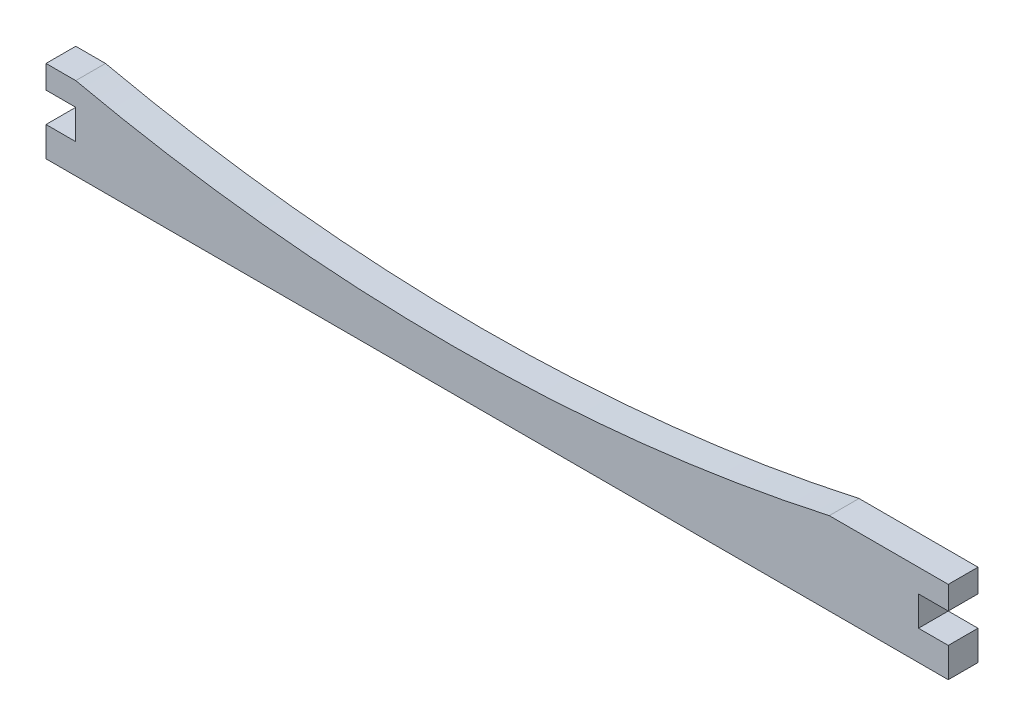
ISO-10303-21;
HEADER;
FILE_DESCRIPTION(('STEP AP214'),'2;1');
FILE_NAME('part.step','',(''),(''),'','','');
FILE_SCHEMA(('AUTOMOTIVE_DESIGN { 1 0 10303 214 1 1 1 1 }'));
ENDSEC;
DATA;
#1=APPLICATION_CONTEXT('core data for automotive mechanical design processes');
#2=APPLICATION_PROTOCOL_DEFINITION('international standard','automotive_design',2000,#1);
#3=PRODUCT_CONTEXT('',#1,'mechanical');
#4=PRODUCT('Part','Part','',(#3));
#5=PRODUCT_RELATED_PRODUCT_CATEGORY('part','',(#4));
#6=PRODUCT_DEFINITION_FORMATION('','',#4);
#7=PRODUCT_DEFINITION_CONTEXT('part definition',#1,'design');
#8=PRODUCT_DEFINITION('design','',#6,#7);
#9=PRODUCT_DEFINITION_SHAPE('','',#8);
#10=(LENGTH_UNIT() NAMED_UNIT(*) SI_UNIT(.MILLI.,.METRE.));
#11=(NAMED_UNIT(*) PLANE_ANGLE_UNIT() SI_UNIT($,.RADIAN.));
#12=(NAMED_UNIT(*) SI_UNIT($,.STERADIAN.) SOLID_ANGLE_UNIT());
#13=UNCERTAINTY_MEASURE_WITH_UNIT(LENGTH_MEASURE(1.E-05),#10,'distance_accuracy_value','');
#14=(GEOMETRIC_REPRESENTATION_CONTEXT(3) GLOBAL_UNCERTAINTY_ASSIGNED_CONTEXT((#13)) GLOBAL_UNIT_ASSIGNED_CONTEXT((#10,
#11,#12)) REPRESENTATION_CONTEXT('',''));
#15=CARTESIAN_POINT('',(0.,0.,0.));
#16=DIRECTION('',(0.,0.,1.));
#17=DIRECTION('',(1.,0.,0.));
#18=AXIS2_PLACEMENT_3D('',#15,#16,#17);
#19=CARTESIAN_POINT('',(-123.,0.,9.));
#20=DIRECTION('',(-1.,0.,0.));
#21=DIRECTION('',(0.,0.,1.));
#22=AXIS2_PLACEMENT_3D('',#19,#20,#21);
#23=PLANE('',#22);
#24=DIRECTION('',(0.,1.,0.));
#25=VECTOR('',#24,1.);
#26=CARTESIAN_POINT('',(-123.,0.,0.));
#27=LINE('',#26,#25);
#28=CARTESIAN_POINT('',(-123.,18.,0.));
#29=VERTEX_POINT('',#28);
#30=CARTESIAN_POINT('',(-123.,25.,0.));
#31=VERTEX_POINT('',#30);
#32=EDGE_CURVE('E228',#29,#31,#27,.T.);
#33=ORIENTED_EDGE('',*,*,#32,.F.);
#34=DIRECTION('',(0.,0.,-1.));
#35=VECTOR('',#34,1.);
#36=CARTESIAN_POINT('',(-123.,18.,9.));
#37=LINE('',#36,#35);
#38=CARTESIAN_POINT('',(-123.,18.,9.));
#39=VERTEX_POINT('',#38);
#40=EDGE_CURVE('E207',#39,#29,#37,.T.);
#41=ORIENTED_EDGE('',*,*,#40,.F.);
#42=DIRECTION('',(0.,1.,0.));
#43=VECTOR('',#42,1.);
#44=CARTESIAN_POINT('',(-123.,0.,9.));
#45=LINE('',#44,#43);
#46=CARTESIAN_POINT('',(-123.,25.,9.));
#47=VERTEX_POINT('',#46);
#48=EDGE_CURVE('E216',#39,#47,#45,.T.);
#49=ORIENTED_EDGE('',*,*,#48,.T.);
#50=DIRECTION('',(0.,0.,-1.));
#51=VECTOR('',#50,1.);
#52=CARTESIAN_POINT('',(-123.,25.,9.));
#53=LINE('',#52,#51);
#54=EDGE_CURVE('E43',#47,#31,#53,.T.);
#55=ORIENTED_EDGE('',*,*,#54,.T.);
#56=EDGE_LOOP('',(#33,#41,#49,#55));
#57=FACE_BOUND('',#56,.T.);
#58=ADVANCED_FACE('F35',(#57),#23,.T.);
#59=CARTESIAN_POINT('',(-123.,0.,9.));
#60=VERTEX_POINT('',#59);
#61=CARTESIAN_POINT('',(-123.,9.,9.));
#62=VERTEX_POINT('',#61);
#63=EDGE_CURVE('E217',#60,#62,#45,.T.);
#64=ORIENTED_EDGE('',*,*,#63,.T.);
#65=DIRECTION('',(0.,0.,-1.));
#66=VECTOR('',#65,1.);
#67=CARTESIAN_POINT('',(-123.,9.,9.));
#68=LINE('',#67,#66);
#69=CARTESIAN_POINT('',(-123.,9.,0.));
#70=VERTEX_POINT('',#69);
#71=EDGE_CURVE('E204',#62,#70,#68,.T.);
#72=ORIENTED_EDGE('',*,*,#71,.T.);
#73=CARTESIAN_POINT('',(-123.,0.,0.));
#74=VERTEX_POINT('',#73);
#75=EDGE_CURVE('E229',#74,#70,#27,.T.);
#76=ORIENTED_EDGE('',*,*,#75,.F.);
#77=DIRECTION('',(0.,0.,-1.));
#78=VECTOR('',#77,1.);
#79=CARTESIAN_POINT('',(-123.,0.,9.));
#80=LINE('',#79,#78);
#81=EDGE_CURVE('E236',#60,#74,#80,.T.);
#82=ORIENTED_EDGE('',*,*,#81,.F.);
#83=EDGE_LOOP('',(#64,#72,#76,#82));
#84=FACE_BOUND('',#83,.T.);
#85=ADVANCED_FACE('F267',(#84),#23,.T.);
#86=CARTESIAN_POINT('',(0.,0.,9.));
#87=DIRECTION('',(0.,0.,1.));
#88=DIRECTION('',(1.,0.,0.));
#89=AXIS2_PLACEMENT_3D('',#86,#87,#88);
#90=PLANE('',#89);
#91=DIRECTION('',(1.,0.,0.));
#92=VECTOR('',#91,1.);
#93=CARTESIAN_POINT('',(0.,0.,9.));
#94=LINE('',#93,#92);
#95=CARTESIAN_POINT('',(150.,0.,9.));
#96=VERTEX_POINT('',#95);
#97=EDGE_CURVE('E220',#60,#96,#94,.T.);
#98=ORIENTED_EDGE('',*,*,#97,.T.);
#99=DIRECTION('',(0.,1.,0.));
#100=VECTOR('',#99,1.);
#101=CARTESIAN_POINT('',(150.,0.,9.));
#102=LINE('',#101,#100);
#103=CARTESIAN_POINT('',(150.,9.,9.));
#104=VERTEX_POINT('',#103);
#105=EDGE_CURVE('E159',#96,#104,#102,.T.);
#106=ORIENTED_EDGE('',*,*,#105,.T.);
#107=DIRECTION('',(-1.,0.,0.));
#108=VECTOR('',#107,1.);
#109=CARTESIAN_POINT('',(150.,9.,9.));
#110=LINE('',#109,#108);
#111=CARTESIAN_POINT('',(141.,9.,9.));
#112=VERTEX_POINT('',#111);
#113=EDGE_CURVE('E168',#104,#112,#110,.T.);
#114=ORIENTED_EDGE('',*,*,#113,.T.);
#115=DIRECTION('',(0.,1.,0.));
#116=VECTOR('',#115,1.);
#117=CARTESIAN_POINT('',(141.,9.,9.));
#118=LINE('',#117,#116);
#119=CARTESIAN_POINT('',(141.,18.,9.));
#120=VERTEX_POINT('',#119);
#121=EDGE_CURVE('E164',#112,#120,#118,.T.);
#122=ORIENTED_EDGE('',*,*,#121,.T.);
#123=DIRECTION('',(1.,0.,0.));
#124=VECTOR('',#123,1.);
#125=CARTESIAN_POINT('',(141.,18.,9.));
#126=LINE('',#125,#124);
#127=CARTESIAN_POINT('',(150.,18.,9.));
#128=VERTEX_POINT('',#127);
#129=EDGE_CURVE('E145',#120,#128,#126,.T.);
#130=ORIENTED_EDGE('',*,*,#129,.T.);
#131=DIRECTION('',(0.,1.,0.));
#132=VECTOR('',#131,1.);
#133=CARTESIAN_POINT('',(150.,18.,9.));
#134=LINE('',#133,#132);
#135=CARTESIAN_POINT('',(150.,25.,9.));
#136=VERTEX_POINT('',#135);
#137=EDGE_CURVE('E155',#128,#136,#134,.T.);
#138=ORIENTED_EDGE('',*,*,#137,.T.);
#139=DIRECTION('',(-1.,0.,0.));
#140=VECTOR('',#139,1.);
#141=CARTESIAN_POINT('',(0.,25.,9.));
#142=LINE('',#141,#140);
#143=CARTESIAN_POINT('',(114.,25.,9.));
#144=VERTEX_POINT('',#143);
#145=EDGE_CURVE('E59',#136,#144,#142,.T.);
#146=ORIENTED_EDGE('',*,*,#145,.T.);
#147=CARTESIAN_POINT('',(0.,538.59,9.));
#148=DIRECTION('',(0.,0.,1.));
#149=DIRECTION('',(1.,0.,0.));
#150=AXIS2_PLACEMENT_3D('',#147,#148,#149);
#151=CIRCLE('',#150,526.09);
#152=CARTESIAN_POINT('',(-114.,25.,9.));
#153=VERTEX_POINT('',#152);
#154=EDGE_CURVE('E210',#153,#144,#151,.T.);
#155=ORIENTED_EDGE('',*,*,#154,.F.);
#156=DIRECTION('',(1.,0.,0.));
#157=VECTOR('',#156,1.);
#158=CARTESIAN_POINT('',(0.,24.9999999999996,9.));
#159=LINE('',#158,#157);
#160=EDGE_CURVE('E212',#47,#153,#159,.T.);
#161=ORIENTED_EDGE('',*,*,#160,.F.);
#162=ORIENTED_EDGE('',*,*,#48,.F.);
#163=DIRECTION('',(-1.,0.,0.));
#164=VECTOR('',#163,1.);
#165=CARTESIAN_POINT('',(-123.,18.,9.));
#166=LINE('',#165,#164);
#167=CARTESIAN_POINT('',(-114.,18.,9.));
#168=VERTEX_POINT('',#167);
#169=EDGE_CURVE('E189',#168,#39,#166,.T.);
#170=ORIENTED_EDGE('',*,*,#169,.F.);
#171=DIRECTION('',(0.,1.,0.));
#172=VECTOR('',#171,1.);
#173=CARTESIAN_POINT('',(-114.,18.,9.));
#174=LINE('',#173,#172);
#175=CARTESIAN_POINT('',(-114.,9.,9.));
#176=VERTEX_POINT('',#175);
#177=EDGE_CURVE('E194',#176,#168,#174,.T.);
#178=ORIENTED_EDGE('',*,*,#177,.F.);
#179=DIRECTION('',(1.,0.,0.));
#180=VECTOR('',#179,1.);
#181=CARTESIAN_POINT('',(-123.,9.,9.));
#182=LINE('',#181,#180);
#183=EDGE_CURVE('E191',#62,#176,#182,.T.);
#184=ORIENTED_EDGE('',*,*,#183,.F.);
#185=ORIENTED_EDGE('',*,*,#63,.F.);
#186=EDGE_LOOP('',(#98,#106,#114,#122,#130,#138,#146,#155,#161,#162,#170,#178,#184,#185));
#187=FACE_BOUND('',#186,.T.);
#188=ADVANCED_FACE('F162',(#187),#90,.T.);
#189=CARTESIAN_POINT('',(0.,0.,0.));
#190=DIRECTION('',(0.,0.,1.));
#191=DIRECTION('',(1.,0.,0.));
#192=AXIS2_PLACEMENT_3D('',#189,#190,#191);
#193=PLANE('',#192);
#194=DIRECTION('',(0.,1.,0.));
#195=VECTOR('',#194,1.);
#196=CARTESIAN_POINT('',(150.,0.,0.));
#197=LINE('',#196,#195);
#198=CARTESIAN_POINT('',(150.,0.,0.));
#199=VERTEX_POINT('',#198);
#200=CARTESIAN_POINT('',(150.,9.,0.));
#201=VERTEX_POINT('',#200);
#202=EDGE_CURVE('E171',#199,#201,#197,.T.);
#203=ORIENTED_EDGE('',*,*,#202,.F.);
#204=DIRECTION('',(1.,0.,0.));
#205=VECTOR('',#204,1.);
#206=CARTESIAN_POINT('',(0.,0.,0.));
#207=LINE('',#206,#205);
#208=EDGE_CURVE('E232',#74,#199,#207,.T.);
#209=ORIENTED_EDGE('',*,*,#208,.F.);
#210=ORIENTED_EDGE('',*,*,#75,.T.);
#211=DIRECTION('',(1.,0.,0.));
#212=VECTOR('',#211,1.);
#213=CARTESIAN_POINT('',(-123.,9.,0.));
#214=LINE('',#213,#212);
#215=CARTESIAN_POINT('',(-114.,9.,0.));
#216=VERTEX_POINT('',#215);
#217=EDGE_CURVE('E166',#70,#216,#214,.T.);
#218=ORIENTED_EDGE('',*,*,#217,.T.);
#219=DIRECTION('',(0.,1.,0.));
#220=VECTOR('',#219,1.);
#221=CARTESIAN_POINT('',(-114.,18.,0.));
#222=LINE('',#221,#220);
#223=CARTESIAN_POINT('',(-114.,18.,0.));
#224=VERTEX_POINT('',#223);
#225=EDGE_CURVE('E192',#216,#224,#222,.T.);
#226=ORIENTED_EDGE('',*,*,#225,.T.);
#227=DIRECTION('',(-1.,0.,0.));
#228=VECTOR('',#227,1.);
#229=CARTESIAN_POINT('',(-123.,18.,0.));
#230=LINE('',#229,#228);
#231=EDGE_CURVE('E50',#224,#29,#230,.T.);
#232=ORIENTED_EDGE('',*,*,#231,.T.);
#233=ORIENTED_EDGE('',*,*,#32,.T.);
#234=DIRECTION('',(1.,0.,0.));
#235=VECTOR('',#234,1.);
#236=CARTESIAN_POINT('',(0.,24.9999999999996,0.));
#237=LINE('',#236,#235);
#238=CARTESIAN_POINT('',(-114.,25.,0.));
#239=VERTEX_POINT('',#238);
#240=EDGE_CURVE('E225',#31,#239,#237,.T.);
#241=ORIENTED_EDGE('',*,*,#240,.T.);
#242=CARTESIAN_POINT('',(0.,538.59,0.));
#243=DIRECTION('',(0.,0.,1.));
#244=DIRECTION('',(1.,0.,0.));
#245=AXIS2_PLACEMENT_3D('',#242,#243,#244);
#246=CIRCLE('',#245,526.09);
#247=CARTESIAN_POINT('',(114.,25.,0.));
#248=VERTEX_POINT('',#247);
#249=EDGE_CURVE('E209',#239,#248,#246,.T.);
#250=ORIENTED_EDGE('',*,*,#249,.T.);
#251=DIRECTION('',(-1.,0.,0.));
#252=VECTOR('',#251,1.);
#253=CARTESIAN_POINT('',(0.,25.,0.));
#254=LINE('',#253,#252);
#255=CARTESIAN_POINT('',(150.,25.,0.));
#256=VERTEX_POINT('',#255);
#257=EDGE_CURVE('E213',#256,#248,#254,.T.);
#258=ORIENTED_EDGE('',*,*,#257,.F.);
#259=DIRECTION('',(0.,1.,0.));
#260=VECTOR('',#259,1.);
#261=CARTESIAN_POINT('',(150.,18.,0.));
#262=LINE('',#261,#260);
#263=CARTESIAN_POINT('',(150.,18.,0.));
#264=VERTEX_POINT('',#263);
#265=EDGE_CURVE('E152',#264,#256,#262,.T.);
#266=ORIENTED_EDGE('',*,*,#265,.F.);
#267=DIRECTION('',(1.,0.,0.));
#268=VECTOR('',#267,1.);
#269=CARTESIAN_POINT('',(141.,18.,0.));
#270=LINE('',#269,#268);
#271=CARTESIAN_POINT('',(141.,18.,0.));
#272=VERTEX_POINT('',#271);
#273=EDGE_CURVE('E148',#272,#264,#270,.T.);
#274=ORIENTED_EDGE('',*,*,#273,.F.);
#275=DIRECTION('',(0.,1.,0.));
#276=VECTOR('',#275,1.);
#277=CARTESIAN_POINT('',(141.,9.,0.));
#278=LINE('',#277,#276);
#279=CARTESIAN_POINT('',(141.,9.,0.));
#280=VERTEX_POINT('',#279);
#281=EDGE_CURVE('E185',#280,#272,#278,.T.);
#282=ORIENTED_EDGE('',*,*,#281,.F.);
#283=DIRECTION('',(-1.,0.,0.));
#284=VECTOR('',#283,1.);
#285=CARTESIAN_POINT('',(150.,9.,0.));
#286=LINE('',#285,#284);
#287=EDGE_CURVE('E182',#201,#280,#286,.T.);
#288=ORIENTED_EDGE('',*,*,#287,.F.);
#289=EDGE_LOOP('',(#203,#209,#210,#218,#226,#232,#233,#241,#250,#258,#266,#274,#282,#288));
#290=FACE_BOUND('',#289,.T.);
#291=ADVANCED_FACE('F249',(#290),#193,.F.);
#292=CARTESIAN_POINT('',(0.,538.59,9.));
#293=DIRECTION('',(0.,0.,-1.));
#294=DIRECTION('',(-1.,0.,0.));
#295=AXIS2_PLACEMENT_3D('',#292,#293,#294);
#296=CYLINDRICAL_SURFACE('',#295,526.09);
#297=ORIENTED_EDGE('',*,*,#249,.F.);
#298=DIRECTION('',(0.,0.,-1.));
#299=VECTOR('',#298,1.);
#300=CARTESIAN_POINT('',(-114.,25.,9.));
#301=LINE('',#300,#299);
#302=EDGE_CURVE('E11',#153,#239,#301,.T.);
#303=ORIENTED_EDGE('',*,*,#302,.F.);
#304=ORIENTED_EDGE('',*,*,#154,.T.);
#305=DIRECTION('',(0.,0.,-1.));
#306=VECTOR('',#305,1.);
#307=CARTESIAN_POINT('',(114.,25.,9.));
#308=LINE('',#307,#306);
#309=EDGE_CURVE('E80',#144,#248,#308,.T.);
#310=ORIENTED_EDGE('',*,*,#309,.T.);
#311=EDGE_LOOP('',(#297,#303,#304,#310));
#312=FACE_BOUND('',#311,.T.);
#313=ADVANCED_FACE('F37',(#312),#296,.F.);
#314=CARTESIAN_POINT('',(0.,24.9999999999996,9.));
#315=DIRECTION('',(0.,1.,0.));
#316=DIRECTION('',(-1.,0.,0.));
#317=AXIS2_PLACEMENT_3D('',#314,#315,#316);
#318=PLANE('',#317);
#319=ORIENTED_EDGE('',*,*,#240,.F.);
#320=ORIENTED_EDGE('',*,*,#54,.F.);
#321=ORIENTED_EDGE('',*,*,#160,.T.);
#322=ORIENTED_EDGE('',*,*,#302,.T.);
#323=EDGE_LOOP('',(#319,#320,#321,#322));
#324=FACE_BOUND('',#323,.T.);
#325=ADVANCED_FACE('F246',(#324),#318,.T.);
#326=CARTESIAN_POINT('',(0.,0.,9.));
#327=DIRECTION('',(0.,1.,0.));
#328=DIRECTION('',(0.,0.,1.));
#329=AXIS2_PLACEMENT_3D('',#326,#327,#328);
#330=PLANE('',#329);
#331=DIRECTION('',(0.,0.,-1.));
#332=VECTOR('',#331,1.);
#333=CARTESIAN_POINT('',(150.,0.,52.8292140016223));
#334=LINE('',#333,#332);
#335=EDGE_CURVE('E177',#96,#199,#334,.T.);
#336=ORIENTED_EDGE('',*,*,#335,.F.);
#337=ORIENTED_EDGE('',*,*,#97,.F.);
#338=ORIENTED_EDGE('',*,*,#81,.T.);
#339=ORIENTED_EDGE('',*,*,#208,.T.);
#340=EDGE_LOOP('',(#336,#337,#338,#339));
#341=FACE_BOUND('',#340,.T.);
#342=ADVANCED_FACE('F263',(#341),#330,.F.);
#343=CARTESIAN_POINT('',(0.,25.,9.));
#344=DIRECTION('',(0.,-1.,0.));
#345=DIRECTION('',(0.,0.,-1.));
#346=AXIS2_PLACEMENT_3D('',#343,#344,#345);
#347=PLANE('',#346);
#348=ORIENTED_EDGE('',*,*,#257,.T.);
#349=ORIENTED_EDGE('',*,*,#309,.F.);
#350=ORIENTED_EDGE('',*,*,#145,.F.);
#351=DIRECTION('',(0.,0.,-1.));
#352=VECTOR('',#351,1.);
#353=CARTESIAN_POINT('',(150.,25.,52.8292140016223));
#354=LINE('',#353,#352);
#355=EDGE_CURVE('E158',#136,#256,#354,.T.);
#356=ORIENTED_EDGE('',*,*,#355,.T.);
#357=EDGE_LOOP('',(#348,#349,#350,#356));
#358=FACE_BOUND('',#357,.T.);
#359=ADVANCED_FACE('F275',(#358),#347,.F.);
#360=CARTESIAN_POINT('',(-123.,18.,9.));
#361=DIRECTION('',(0.,-1.,0.));
#362=DIRECTION('',(0.,0.,-1.));
#363=AXIS2_PLACEMENT_3D('',#360,#361,#362);
#364=PLANE('',#363);
#365=ORIENTED_EDGE('',*,*,#231,.F.);
#366=DIRECTION('',(0.,0.,-1.));
#367=VECTOR('',#366,1.);
#368=CARTESIAN_POINT('',(-114.,18.,9.));
#369=LINE('',#368,#367);
#370=EDGE_CURVE('E195',#168,#224,#369,.T.);
#371=ORIENTED_EDGE('',*,*,#370,.F.);
#372=ORIENTED_EDGE('',*,*,#169,.T.);
#373=ORIENTED_EDGE('',*,*,#40,.T.);
#374=EDGE_LOOP('',(#365,#371,#372,#373));
#375=FACE_BOUND('',#374,.T.);
#376=ADVANCED_FACE('F256',(#375),#364,.T.);
#377=CARTESIAN_POINT('',(-123.,9.,9.));
#378=DIRECTION('',(0.,1.,0.));
#379=DIRECTION('',(0.,0.,1.));
#380=AXIS2_PLACEMENT_3D('',#377,#378,#379);
#381=PLANE('',#380);
#382=ORIENTED_EDGE('',*,*,#217,.F.);
#383=ORIENTED_EDGE('',*,*,#71,.F.);
#384=ORIENTED_EDGE('',*,*,#183,.T.);
#385=DIRECTION('',(0.,0.,-1.));
#386=VECTOR('',#385,1.);
#387=CARTESIAN_POINT('',(-114.,9.,9.));
#388=LINE('',#387,#386);
#389=EDGE_CURVE('E202',#176,#216,#388,.T.);
#390=ORIENTED_EDGE('',*,*,#389,.T.);
#391=EDGE_LOOP('',(#382,#383,#384,#390));
#392=FACE_BOUND('',#391,.T.);
#393=ADVANCED_FACE('F284',(#392),#381,.T.);
#394=CARTESIAN_POINT('',(-114.,18.,9.));
#395=DIRECTION('',(-1.,0.,0.));
#396=DIRECTION('',(0.,-1.,0.));
#397=AXIS2_PLACEMENT_3D('',#394,#395,#396);
#398=PLANE('',#397);
#399=ORIENTED_EDGE('',*,*,#225,.F.);
#400=ORIENTED_EDGE('',*,*,#389,.F.);
#401=ORIENTED_EDGE('',*,*,#177,.T.);
#402=ORIENTED_EDGE('',*,*,#370,.T.);
#403=EDGE_LOOP('',(#399,#400,#401,#402));
#404=FACE_BOUND('',#403,.T.);
#405=ADVANCED_FACE('F253',(#404),#398,.T.);
#406=CARTESIAN_POINT('',(150.,0.,52.8292140016223));
#407=DIRECTION('',(-1.,0.,0.));
#408=DIRECTION('',(0.,0.,1.));
#409=AXIS2_PLACEMENT_3D('',#406,#407,#408);
#410=PLANE('',#409);
#411=ORIENTED_EDGE('',*,*,#105,.F.);
#412=ORIENTED_EDGE('',*,*,#335,.T.);
#413=ORIENTED_EDGE('',*,*,#202,.T.);
#414=DIRECTION('',(0.,0.,-1.));
#415=VECTOR('',#414,1.);
#416=CARTESIAN_POINT('',(150.,9.,52.8292140016223));
#417=LINE('',#416,#415);
#418=EDGE_CURVE('E180',#104,#201,#417,.T.);
#419=ORIENTED_EDGE('',*,*,#418,.F.);
#420=EDGE_LOOP('',(#411,#412,#413,#419));
#421=FACE_BOUND('',#420,.T.);
#422=ADVANCED_FACE('F290',(#421),#410,.F.);
#423=CARTESIAN_POINT('',(150.,9.,52.8292140016223));
#424=DIRECTION('',(0.,-1.,0.));
#425=DIRECTION('',(0.,0.,-1.));
#426=AXIS2_PLACEMENT_3D('',#423,#424,#425);
#427=PLANE('',#426);
#428=ORIENTED_EDGE('',*,*,#113,.F.);
#429=ORIENTED_EDGE('',*,*,#418,.T.);
#430=ORIENTED_EDGE('',*,*,#287,.T.);
#431=DIRECTION('',(0.,0.,-1.));
#432=VECTOR('',#431,1.);
#433=CARTESIAN_POINT('',(141.,9.,52.8292140016223));
#434=LINE('',#433,#432);
#435=EDGE_CURVE('E183',#112,#280,#434,.T.);
#436=ORIENTED_EDGE('',*,*,#435,.F.);
#437=EDGE_LOOP('',(#428,#429,#430,#436));
#438=FACE_BOUND('',#437,.T.);
#439=ADVANCED_FACE('F293',(#438),#427,.F.);
#440=CARTESIAN_POINT('',(141.,9.,52.8292140016223));
#441=DIRECTION('',(-1.,0.,0.));
#442=DIRECTION('',(0.,0.,1.));
#443=AXIS2_PLACEMENT_3D('',#440,#441,#442);
#444=PLANE('',#443);
#445=ORIENTED_EDGE('',*,*,#121,.F.);
#446=ORIENTED_EDGE('',*,*,#435,.T.);
#447=ORIENTED_EDGE('',*,*,#281,.T.);
#448=DIRECTION('',(0.,0.,-1.));
#449=VECTOR('',#448,1.);
#450=CARTESIAN_POINT('',(141.,18.,52.8292140016223));
#451=LINE('',#450,#449);
#452=EDGE_CURVE('E186',#120,#272,#451,.T.);
#453=ORIENTED_EDGE('',*,*,#452,.F.);
#454=EDGE_LOOP('',(#445,#446,#447,#453));
#455=FACE_BOUND('',#454,.T.);
#456=ADVANCED_FACE('F297',(#455),#444,.F.);
#457=CARTESIAN_POINT('',(141.,18.,52.8292140016223));
#458=DIRECTION('',(0.,1.,0.));
#459=DIRECTION('',(0.,0.,1.));
#460=AXIS2_PLACEMENT_3D('',#457,#458,#459);
#461=PLANE('',#460);
#462=ORIENTED_EDGE('',*,*,#129,.F.);
#463=ORIENTED_EDGE('',*,*,#452,.T.);
#464=ORIENTED_EDGE('',*,*,#273,.T.);
#465=DIRECTION('',(0.,0.,-1.));
#466=VECTOR('',#465,1.);
#467=CARTESIAN_POINT('',(150.,18.,52.8292140016223));
#468=LINE('',#467,#466);
#469=EDGE_CURVE('E141',#128,#264,#468,.T.);
#470=ORIENTED_EDGE('',*,*,#469,.F.);
#471=EDGE_LOOP('',(#462,#463,#464,#470));
#472=FACE_BOUND('',#471,.T.);
#473=ADVANCED_FACE('F143',(#472),#461,.F.);
#474=CARTESIAN_POINT('',(150.,18.,52.8292140016223));
#475=DIRECTION('',(-1.,0.,0.));
#476=DIRECTION('',(0.,0.,1.));
#477=AXIS2_PLACEMENT_3D('',#474,#475,#476);
#478=PLANE('',#477);
#479=ORIENTED_EDGE('',*,*,#137,.F.);
#480=ORIENTED_EDGE('',*,*,#469,.T.);
#481=ORIENTED_EDGE('',*,*,#265,.T.);
#482=ORIENTED_EDGE('',*,*,#355,.F.);
#483=EDGE_LOOP('',(#479,#480,#481,#482));
#484=FACE_BOUND('',#483,.T.);
#485=ADVANCED_FACE('F156',(#484),#478,.F.);
#486=CLOSED_SHELL('',(#58,#85,#188,#291,#313,#325,#342,#359,#376,#393,#405,#422,#439,#456,#473,#485));
#487=MANIFOLD_SOLID_BREP('B2',#486);
#488=ADVANCED_BREP_SHAPE_REPRESENTATION('',(#18,#487),#14);
#489=SHAPE_DEFINITION_REPRESENTATION(#9,#488);
ENDSEC;
END-ISO-10303-21;
